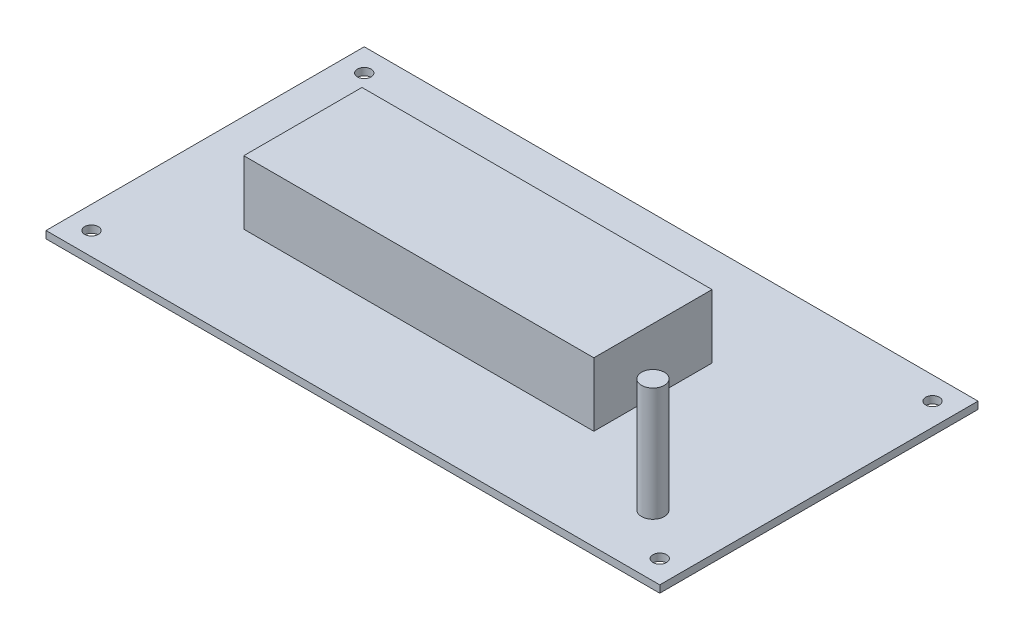
ISO-10303-21;
HEADER;
FILE_DESCRIPTION(('STEP AP214'),'2;1');
FILE_NAME('part.step','',(''),(''),'','','');
FILE_SCHEMA(('AUTOMOTIVE_DESIGN { 1 0 10303 214 1 1 1 1 }'));
ENDSEC;
DATA;
#1=APPLICATION_CONTEXT('core data for automotive mechanical design processes');
#2=APPLICATION_PROTOCOL_DEFINITION('international standard','automotive_design',2000,#1);
#3=PRODUCT_CONTEXT('',#1,'mechanical');
#4=PRODUCT('Part','Part','',(#3));
#5=PRODUCT_RELATED_PRODUCT_CATEGORY('part','',(#4));
#6=PRODUCT_DEFINITION_FORMATION('','',#4);
#7=PRODUCT_DEFINITION_CONTEXT('part definition',#1,'design');
#8=PRODUCT_DEFINITION('design','',#6,#7);
#9=PRODUCT_DEFINITION_SHAPE('','',#8);
#10=(LENGTH_UNIT() NAMED_UNIT(*) SI_UNIT(.MILLI.,.METRE.));
#11=(NAMED_UNIT(*) PLANE_ANGLE_UNIT() SI_UNIT($,.RADIAN.));
#12=(NAMED_UNIT(*) SI_UNIT($,.STERADIAN.) SOLID_ANGLE_UNIT());
#13=UNCERTAINTY_MEASURE_WITH_UNIT(LENGTH_MEASURE(1.E-05),#10,'distance_accuracy_value','');
#14=(GEOMETRIC_REPRESENTATION_CONTEXT(3) GLOBAL_UNCERTAINTY_ASSIGNED_CONTEXT((#13)) GLOBAL_UNIT_ASSIGNED_CONTEXT((#10,
#11,#12)) REPRESENTATION_CONTEXT('',''));
#15=CARTESIAN_POINT('',(0.,0.,0.));
#16=DIRECTION('',(0.,0.,1.));
#17=DIRECTION('',(1.,0.,0.));
#18=AXIS2_PLACEMENT_3D('',#15,#16,#17);
#19=CARTESIAN_POINT('',(0.,1.59999999999999,0.));
#20=DIRECTION('',(0.,-1.,0.));
#21=DIRECTION('',(0.,0.,-1.));
#22=AXIS2_PLACEMENT_3D('',#19,#20,#21);
#23=PLANE('',#22);
#24=CARTESIAN_POINT('',(62.5,1.59999999999999,30.));
#25=DIRECTION('',(0.,1.,0.));
#26=DIRECTION('',(0.,0.,1.));
#27=AXIS2_PLACEMENT_3D('',#24,#25,#26);
#28=CIRCLE('',#27,1.5);
#29=CARTESIAN_POINT('',(62.5,1.59999999999999,31.5));
#30=VERTEX_POINT('',#29);
#31=EDGE_CURVE('E156',#30,#30,#28,.T.);
#32=ORIENTED_EDGE('',*,*,#31,.F.);
#33=EDGE_LOOP('',(#32));
#34=FACE_BOUND('',#33,.T.);
#35=CARTESIAN_POINT('',(-62.5,1.59999999999999,30.));
#36=DIRECTION('',(0.,1.,0.));
#37=DIRECTION('',(0.,0.,1.));
#38=AXIS2_PLACEMENT_3D('',#35,#36,#37);
#39=CIRCLE('',#38,1.5);
#40=CARTESIAN_POINT('',(-62.5,1.59999999999999,31.5));
#41=VERTEX_POINT('',#40);
#42=EDGE_CURVE('E153',#41,#41,#39,.F.);
#43=ORIENTED_EDGE('',*,*,#42,.T.);
#44=EDGE_LOOP('',(#43));
#45=FACE_BOUND('',#44,.T.);
#46=DIRECTION('',(0.,0.,-1.));
#47=VECTOR('',#46,1.);
#48=CARTESIAN_POINT('',(67.5,1.59999999999999,35.));
#49=LINE('',#48,#47);
#50=CARTESIAN_POINT('',(67.5,1.59999999999999,35.));
#51=VERTEX_POINT('',#50);
#52=CARTESIAN_POINT('',(67.5,1.60000000000002,-35.));
#53=VERTEX_POINT('',#52);
#54=EDGE_CURVE('E169',#51,#53,#49,.T.);
#55=ORIENTED_EDGE('',*,*,#54,.T.);
#56=DIRECTION('',(-1.,0.,0.));
#57=VECTOR('',#56,1.);
#58=CARTESIAN_POINT('',(-67.5,1.60000000000002,-35.));
#59=LINE('',#58,#57);
#60=CARTESIAN_POINT('',(-67.5,1.60000000000002,-35.));
#61=VERTEX_POINT('',#60);
#62=EDGE_CURVE('E172',#53,#61,#59,.T.);
#63=ORIENTED_EDGE('',*,*,#62,.T.);
#64=DIRECTION('',(0.,0.,1.));
#65=VECTOR('',#64,1.);
#66=CARTESIAN_POINT('',(-67.5,1.59999999999999,35.));
#67=LINE('',#66,#65);
#68=CARTESIAN_POINT('',(-67.5,1.59999999999999,35.));
#69=VERTEX_POINT('',#68);
#70=EDGE_CURVE('E176',#61,#69,#67,.T.);
#71=ORIENTED_EDGE('',*,*,#70,.T.);
#72=DIRECTION('',(1.,0.,0.));
#73=VECTOR('',#72,1.);
#74=CARTESIAN_POINT('',(-67.5,1.59999999999999,35.));
#75=LINE('',#74,#73);
#76=EDGE_CURVE('E178',#69,#51,#75,.T.);
#77=ORIENTED_EDGE('',*,*,#76,.T.);
#78=EDGE_LOOP('',(#55,#63,#71,#77));
#79=FACE_BOUND('',#78,.T.);
#80=CARTESIAN_POINT('',(62.5,1.59999999999999,-30.));
#81=DIRECTION('',(0.,1.,0.));
#82=DIRECTION('',(0.,0.,1.));
#83=AXIS2_PLACEMENT_3D('',#80,#81,#82);
#84=CIRCLE('',#83,1.5);
#85=CARTESIAN_POINT('',(62.5,1.59999999999999,-28.5));
#86=VERTEX_POINT('',#85);
#87=EDGE_CURVE('E148',#86,#86,#84,.F.);
#88=ORIENTED_EDGE('',*,*,#87,.T.);
#89=EDGE_LOOP('',(#88));
#90=FACE_BOUND('',#89,.T.);
#91=CARTESIAN_POINT('',(-62.5,1.59999999999999,-30.));
#92=DIRECTION('',(0.,1.,0.));
#93=DIRECTION('',(0.,0.,1.));
#94=AXIS2_PLACEMENT_3D('',#91,#92,#93);
#95=CIRCLE('',#94,1.5);
#96=CARTESIAN_POINT('',(-62.5,1.59999999999999,-28.5));
#97=VERTEX_POINT('',#96);
#98=EDGE_CURVE('E145',#97,#97,#95,.T.);
#99=ORIENTED_EDGE('',*,*,#98,.F.);
#100=EDGE_LOOP('',(#99));
#101=FACE_BOUND('',#100,.T.);
#102=CARTESIAN_POINT('',(52.5,1.59999999999996,21.5));
#103=DIRECTION('',(0.,-1.,0.));
#104=DIRECTION('',(0.,0.,-1.));
#105=AXIS2_PLACEMENT_3D('',#102,#103,#104);
#106=CIRCLE('',#105,2.5);
#107=CARTESIAN_POINT('',(52.5,1.59999999999996,19.));
#108=VERTEX_POINT('',#107);
#109=EDGE_CURVE('E13',#108,#108,#106,.F.);
#110=ORIENTED_EDGE('',*,*,#109,.F.);
#111=EDGE_LOOP('',(#110));
#112=FACE_BOUND('',#111,.T.);
#113=DIRECTION('',(0.,0.,1.));
#114=VECTOR('',#113,1.);
#115=CARTESIAN_POINT('',(-46.,1.59999999999999,-13.));
#116=LINE('',#115,#114);
#117=CARTESIAN_POINT('',(-46.,1.59999999999999,-13.));
#118=VERTEX_POINT('',#117);
#119=CARTESIAN_POINT('',(-46.,1.59999999999999,13.));
#120=VERTEX_POINT('',#119);
#121=EDGE_CURVE('E135',#118,#120,#116,.T.);
#122=ORIENTED_EDGE('',*,*,#121,.F.);
#123=DIRECTION('',(-1.,0.,0.));
#124=VECTOR('',#123,1.);
#125=CARTESIAN_POINT('',(-46.,1.59999999999999,-13.));
#126=LINE('',#125,#124);
#127=CARTESIAN_POINT('',(31.,1.59999999999999,-13.));
#128=VERTEX_POINT('',#127);
#129=EDGE_CURVE('E132',#128,#118,#126,.T.);
#130=ORIENTED_EDGE('',*,*,#129,.F.);
#131=DIRECTION('',(0.,0.,-1.));
#132=VECTOR('',#131,1.);
#133=CARTESIAN_POINT('',(31.,1.59999999999999,-13.));
#134=LINE('',#133,#132);
#135=CARTESIAN_POINT('',(31.,1.59999999999999,13.));
#136=VERTEX_POINT('',#135);
#137=EDGE_CURVE('E70',#136,#128,#134,.T.);
#138=ORIENTED_EDGE('',*,*,#137,.F.);
#139=DIRECTION('',(1.,0.,0.));
#140=VECTOR('',#139,1.);
#141=CARTESIAN_POINT('',(-46.,1.59999999999999,13.));
#142=LINE('',#141,#140);
#143=EDGE_CURVE('E65',#120,#136,#142,.T.);
#144=ORIENTED_EDGE('',*,*,#143,.F.);
#145=EDGE_LOOP('',(#122,#130,#138,#144));
#146=FACE_BOUND('',#145,.T.);
#147=ADVANCED_FACE('F50',(#34,#45,#79,#90,#101,#112,#146),#23,.F.);
#148=CARTESIAN_POINT('',(0.,0.,0.));
#149=DIRECTION('',(0.,-1.,0.));
#150=DIRECTION('',(0.,0.,-1.));
#151=AXIS2_PLACEMENT_3D('',#148,#149,#150);
#152=PLANE('',#151);
#153=CARTESIAN_POINT('',(-62.5,0.,30.));
#154=DIRECTION('',(0.,-1.,0.));
#155=DIRECTION('',(0.,0.,-1.));
#156=AXIS2_PLACEMENT_3D('',#153,#154,#155);
#157=CIRCLE('',#156,1.5);
#158=CARTESIAN_POINT('',(-62.5,0.,28.5));
#159=VERTEX_POINT('',#158);
#160=EDGE_CURVE('E152',#159,#159,#157,.T.);
#161=ORIENTED_EDGE('',*,*,#160,.F.);
#162=EDGE_LOOP('',(#161));
#163=FACE_BOUND('',#162,.T.);
#164=CARTESIAN_POINT('',(62.5,0.,-30.));
#165=DIRECTION('',(0.,-1.,0.));
#166=DIRECTION('',(0.,0.,-1.));
#167=AXIS2_PLACEMENT_3D('',#164,#165,#166);
#168=CIRCLE('',#167,1.5);
#169=CARTESIAN_POINT('',(62.5,0.,-31.5));
#170=VERTEX_POINT('',#169);
#171=EDGE_CURVE('E165',#170,#170,#168,.T.);
#172=ORIENTED_EDGE('',*,*,#171,.F.);
#173=EDGE_LOOP('',(#172));
#174=FACE_BOUND('',#173,.T.);
#175=DIRECTION('',(0.,0.,-1.));
#176=VECTOR('',#175,1.);
#177=CARTESIAN_POINT('',(67.5,0.,35.));
#178=LINE('',#177,#176);
#179=CARTESIAN_POINT('',(67.5,0.,35.));
#180=VERTEX_POINT('',#179);
#181=CARTESIAN_POINT('',(67.5,0.,-35.));
#182=VERTEX_POINT('',#181);
#183=EDGE_CURVE('E168',#180,#182,#178,.T.);
#184=ORIENTED_EDGE('',*,*,#183,.F.);
#185=DIRECTION('',(1.,0.,0.));
#186=VECTOR('',#185,1.);
#187=CARTESIAN_POINT('',(-67.5,0.,35.));
#188=LINE('',#187,#186);
#189=CARTESIAN_POINT('',(-67.5,0.,35.));
#190=VERTEX_POINT('',#189);
#191=EDGE_CURVE('E173',#190,#180,#188,.T.);
#192=ORIENTED_EDGE('',*,*,#191,.F.);
#193=DIRECTION('',(0.,0.,1.));
#194=VECTOR('',#193,1.);
#195=CARTESIAN_POINT('',(-67.5,0.,35.));
#196=LINE('',#195,#194);
#197=CARTESIAN_POINT('',(-67.5,0.,-35.));
#198=VERTEX_POINT('',#197);
#199=EDGE_CURVE('E186',#198,#190,#196,.T.);
#200=ORIENTED_EDGE('',*,*,#199,.F.);
#201=DIRECTION('',(-1.,0.,0.));
#202=VECTOR('',#201,1.);
#203=CARTESIAN_POINT('',(-67.5,0.,-35.));
#204=LINE('',#203,#202);
#205=EDGE_CURVE('E183',#182,#198,#204,.T.);
#206=ORIENTED_EDGE('',*,*,#205,.F.);
#207=EDGE_LOOP('',(#184,#192,#200,#206));
#208=FACE_BOUND('',#207,.T.);
#209=CARTESIAN_POINT('',(-62.5,0.,-30.));
#210=DIRECTION('',(0.,-1.,0.));
#211=DIRECTION('',(0.,0.,-1.));
#212=AXIS2_PLACEMENT_3D('',#209,#210,#211);
#213=CIRCLE('',#212,1.5);
#214=CARTESIAN_POINT('',(-62.5,0.,-31.5));
#215=VERTEX_POINT('',#214);
#216=EDGE_CURVE('E149',#215,#215,#213,.F.);
#217=ORIENTED_EDGE('',*,*,#216,.T.);
#218=EDGE_LOOP('',(#217));
#219=FACE_BOUND('',#218,.T.);
#220=CARTESIAN_POINT('',(62.5,0.,30.));
#221=DIRECTION('',(0.,-1.,0.));
#222=DIRECTION('',(0.,0.,-1.));
#223=AXIS2_PLACEMENT_3D('',#220,#221,#222);
#224=CIRCLE('',#223,1.5);
#225=CARTESIAN_POINT('',(62.5,0.,28.5));
#226=VERTEX_POINT('',#225);
#227=EDGE_CURVE('E139',#226,#226,#224,.F.);
#228=ORIENTED_EDGE('',*,*,#227,.T.);
#229=EDGE_LOOP('',(#228));
#230=FACE_BOUND('',#229,.T.);
#231=ADVANCED_FACE('F207',(#163,#174,#208,#219,#230),#152,.T.);
#232=CARTESIAN_POINT('',(67.5,1.59999999999999,35.));
#233=DIRECTION('',(-1.,0.,0.));
#234=DIRECTION('',(0.,0.,1.));
#235=AXIS2_PLACEMENT_3D('',#232,#233,#234);
#236=PLANE('',#235);
#237=ORIENTED_EDGE('',*,*,#183,.T.);
#238=DIRECTION('',(0.,-1.,0.));
#239=VECTOR('',#238,1.);
#240=CARTESIAN_POINT('',(67.5,1.60000000000002,-35.));
#241=LINE('',#240,#239);
#242=EDGE_CURVE('E58',#53,#182,#241,.T.);
#243=ORIENTED_EDGE('',*,*,#242,.F.);
#244=ORIENTED_EDGE('',*,*,#54,.F.);
#245=DIRECTION('',(0.,-1.,0.));
#246=VECTOR('',#245,1.);
#247=CARTESIAN_POINT('',(67.5,1.59999999999999,35.));
#248=LINE('',#247,#246);
#249=EDGE_CURVE('E180',#51,#180,#248,.T.);
#250=ORIENTED_EDGE('',*,*,#249,.T.);
#251=EDGE_LOOP('',(#237,#243,#244,#250));
#252=FACE_BOUND('',#251,.T.);
#253=ADVANCED_FACE('F52',(#252),#236,.F.);
#254=CARTESIAN_POINT('',(-67.5,1.60000000000002,-35.));
#255=DIRECTION('',(0.,0.,1.));
#256=DIRECTION('',(1.,0.,0.));
#257=AXIS2_PLACEMENT_3D('',#254,#255,#256);
#258=PLANE('',#257);
#259=ORIENTED_EDGE('',*,*,#205,.T.);
#260=DIRECTION('',(0.,-1.,0.));
#261=VECTOR('',#260,1.);
#262=CARTESIAN_POINT('',(-67.5,1.60000000000002,-35.));
#263=LINE('',#262,#261);
#264=EDGE_CURVE('E194',#61,#198,#263,.T.);
#265=ORIENTED_EDGE('',*,*,#264,.F.);
#266=ORIENTED_EDGE('',*,*,#62,.F.);
#267=ORIENTED_EDGE('',*,*,#242,.T.);
#268=EDGE_LOOP('',(#259,#265,#266,#267));
#269=FACE_BOUND('',#268,.T.);
#270=ADVANCED_FACE('F199',(#269),#258,.F.);
#271=CARTESIAN_POINT('',(-67.5,1.59999999999999,35.));
#272=DIRECTION('',(1.,0.,0.));
#273=DIRECTION('',(0.,0.,-1.));
#274=AXIS2_PLACEMENT_3D('',#271,#272,#273);
#275=PLANE('',#274);
#276=ORIENTED_EDGE('',*,*,#199,.T.);
#277=DIRECTION('',(0.,-1.,0.));
#278=VECTOR('',#277,1.);
#279=CARTESIAN_POINT('',(-67.5,1.59999999999999,35.));
#280=LINE('',#279,#278);
#281=EDGE_CURVE('E191',#69,#190,#280,.T.);
#282=ORIENTED_EDGE('',*,*,#281,.F.);
#283=ORIENTED_EDGE('',*,*,#70,.F.);
#284=ORIENTED_EDGE('',*,*,#264,.T.);
#285=EDGE_LOOP('',(#276,#282,#283,#284));
#286=FACE_BOUND('',#285,.T.);
#287=ADVANCED_FACE('F212',(#286),#275,.F.);
#288=CARTESIAN_POINT('',(-67.5,1.59999999999999,35.));
#289=DIRECTION('',(0.,0.,-1.));
#290=DIRECTION('',(-1.,0.,0.));
#291=AXIS2_PLACEMENT_3D('',#288,#289,#290);
#292=PLANE('',#291);
#293=ORIENTED_EDGE('',*,*,#191,.T.);
#294=ORIENTED_EDGE('',*,*,#249,.F.);
#295=ORIENTED_EDGE('',*,*,#76,.F.);
#296=ORIENTED_EDGE('',*,*,#281,.T.);
#297=EDGE_LOOP('',(#293,#294,#295,#296));
#298=FACE_BOUND('',#297,.T.);
#299=ADVANCED_FACE('F216',(#298),#292,.F.);
#300=CARTESIAN_POINT('',(62.5,-0.00100000000002876,-30.));
#301=DIRECTION('',(0.,1.,0.));
#302=DIRECTION('',(0.,0.,1.));
#303=AXIS2_PLACEMENT_3D('',#300,#301,#302);
#304=CYLINDRICAL_SURFACE('',#303,1.5);
#305=ORIENTED_EDGE('',*,*,#171,.T.);
#306=EDGE_LOOP('',(#305));
#307=FACE_BOUND('',#306,.T.);
#308=ORIENTED_EDGE('',*,*,#87,.F.);
#309=EDGE_LOOP('',(#308));
#310=FACE_BOUND('',#309,.T.);
#311=ADVANCED_FACE('F267',(#307,#310),#304,.F.);
#312=CARTESIAN_POINT('',(-62.5,-0.00100000000002876,-30.));
#313=DIRECTION('',(0.,1.,0.));
#314=DIRECTION('',(0.,0.,1.));
#315=AXIS2_PLACEMENT_3D('',#312,#313,#314);
#316=CYLINDRICAL_SURFACE('',#315,1.5);
#317=ORIENTED_EDGE('',*,*,#216,.F.);
#318=EDGE_LOOP('',(#317));
#319=FACE_BOUND('',#318,.T.);
#320=ORIENTED_EDGE('',*,*,#98,.T.);
#321=EDGE_LOOP('',(#320));
#322=FACE_BOUND('',#321,.T.);
#323=ADVANCED_FACE('F263',(#319,#322),#316,.F.);
#324=CARTESIAN_POINT('',(-62.5,-0.00100000000005651,30.));
#325=DIRECTION('',(0.,1.,0.));
#326=DIRECTION('',(0.,0.,1.));
#327=AXIS2_PLACEMENT_3D('',#324,#325,#326);
#328=CYLINDRICAL_SURFACE('',#327,1.5);
#329=ORIENTED_EDGE('',*,*,#160,.T.);
#330=EDGE_LOOP('',(#329));
#331=FACE_BOUND('',#330,.T.);
#332=ORIENTED_EDGE('',*,*,#42,.F.);
#333=EDGE_LOOP('',(#332));
#334=FACE_BOUND('',#333,.T.);
#335=ADVANCED_FACE('F266',(#331,#334),#328,.F.);
#336=CARTESIAN_POINT('',(62.5,-0.00100000000005651,30.));
#337=DIRECTION('',(0.,1.,0.));
#338=DIRECTION('',(0.,0.,1.));
#339=AXIS2_PLACEMENT_3D('',#336,#337,#338);
#340=CYLINDRICAL_SURFACE('',#339,1.5);
#341=ORIENTED_EDGE('',*,*,#227,.F.);
#342=EDGE_LOOP('',(#341));
#343=FACE_BOUND('',#342,.T.);
#344=ORIENTED_EDGE('',*,*,#31,.T.);
#345=EDGE_LOOP('',(#344));
#346=FACE_BOUND('',#345,.T.);
#347=ADVANCED_FACE('F261',(#343,#346),#340,.F.);
#348=CARTESIAN_POINT('',(52.5,26.6,21.5));
#349=DIRECTION('',(0.,-1.,0.));
#350=DIRECTION('',(0.,0.,-1.));
#351=AXIS2_PLACEMENT_3D('',#348,#349,#350);
#352=CYLINDRICAL_SURFACE('',#351,2.5);
#353=CARTESIAN_POINT('',(52.5,26.6,21.5));
#354=DIRECTION('',(0.,1.,0.));
#355=DIRECTION('',(0.,0.,1.));
#356=AXIS2_PLACEMENT_3D('',#353,#354,#355);
#357=CIRCLE('',#356,2.5);
#358=CARTESIAN_POINT('',(52.5,26.6,24.));
#359=VERTEX_POINT('',#358);
#360=EDGE_CURVE('E136',#359,#359,#357,.T.);
#361=ORIENTED_EDGE('',*,*,#360,.F.);
#362=EDGE_LOOP('',(#361));
#363=FACE_BOUND('',#362,.T.);
#364=ORIENTED_EDGE('',*,*,#109,.T.);
#365=EDGE_LOOP('',(#364));
#366=FACE_BOUND('',#365,.T.);
#367=ADVANCED_FACE('F257',(#363,#366),#352,.T.);
#368=CARTESIAN_POINT('',(52.5,26.6,21.5));
#369=DIRECTION('',(0.,1.,0.));
#370=DIRECTION('',(0.,0.,1.));
#371=AXIS2_PLACEMENT_3D('',#368,#369,#370);
#372=PLANE('',#371);
#373=ORIENTED_EDGE('',*,*,#360,.T.);
#374=EDGE_LOOP('',(#373));
#375=FACE_BOUND('',#374,.T.);
#376=ADVANCED_FACE('F254',(#375),#372,.T.);
#377=CARTESIAN_POINT('',(-46.,15.5999999999999,-13.));
#378=DIRECTION('',(1.,0.,0.));
#379=DIRECTION('',(0.,0.,-1.));
#380=AXIS2_PLACEMENT_3D('',#377,#378,#379);
#381=PLANE('',#380);
#382=ORIENTED_EDGE('',*,*,#121,.T.);
#383=DIRECTION('',(0.,-1.,0.));
#384=VECTOR('',#383,1.);
#385=CARTESIAN_POINT('',(-46.,15.5999999999999,13.));
#386=LINE('',#385,#384);
#387=CARTESIAN_POINT('',(-46.,15.5999999999999,13.));
#388=VERTEX_POINT('',#387);
#389=EDGE_CURVE('E116',#388,#120,#386,.T.);
#390=ORIENTED_EDGE('',*,*,#389,.F.);
#391=DIRECTION('',(0.,0.,1.));
#392=VECTOR('',#391,1.);
#393=CARTESIAN_POINT('',(-46.,15.5999999999999,-13.));
#394=LINE('',#393,#392);
#395=CARTESIAN_POINT('',(-46.,15.5999999999999,-13.));
#396=VERTEX_POINT('',#395);
#397=EDGE_CURVE('E123',#396,#388,#394,.T.);
#398=ORIENTED_EDGE('',*,*,#397,.F.);
#399=DIRECTION('',(0.,-1.,0.));
#400=VECTOR('',#399,1.);
#401=CARTESIAN_POINT('',(-46.,15.5999999999999,-13.));
#402=LINE('',#401,#400);
#403=EDGE_CURVE('E232',#396,#118,#402,.T.);
#404=ORIENTED_EDGE('',*,*,#403,.T.);
#405=EDGE_LOOP('',(#382,#390,#398,#404));
#406=FACE_BOUND('',#405,.T.);
#407=ADVANCED_FACE('F134',(#406),#381,.F.);
#408=CARTESIAN_POINT('',(-46.,15.5999999999999,13.));
#409=DIRECTION('',(0.,0.,-1.));
#410=DIRECTION('',(-1.,0.,0.));
#411=AXIS2_PLACEMENT_3D('',#408,#409,#410);
#412=PLANE('',#411);
#413=ORIENTED_EDGE('',*,*,#143,.T.);
#414=DIRECTION('',(0.,-1.,0.));
#415=VECTOR('',#414,1.);
#416=CARTESIAN_POINT('',(31.,15.5999999999999,13.));
#417=LINE('',#416,#415);
#418=CARTESIAN_POINT('',(31.,15.5999999999999,13.));
#419=VERTEX_POINT('',#418);
#420=EDGE_CURVE('E119',#419,#136,#417,.T.);
#421=ORIENTED_EDGE('',*,*,#420,.F.);
#422=DIRECTION('',(1.,0.,0.));
#423=VECTOR('',#422,1.);
#424=CARTESIAN_POINT('',(-46.,15.5999999999999,13.));
#425=LINE('',#424,#423);
#426=EDGE_CURVE('E112',#388,#419,#425,.T.);
#427=ORIENTED_EDGE('',*,*,#426,.F.);
#428=ORIENTED_EDGE('',*,*,#389,.T.);
#429=EDGE_LOOP('',(#413,#421,#427,#428));
#430=FACE_BOUND('',#429,.T.);
#431=ADVANCED_FACE('F114',(#430),#412,.F.);
#432=CARTESIAN_POINT('',(31.,15.5999999999999,-13.));
#433=DIRECTION('',(-1.,0.,0.));
#434=DIRECTION('',(0.,0.,1.));
#435=AXIS2_PLACEMENT_3D('',#432,#433,#434);
#436=PLANE('',#435);
#437=ORIENTED_EDGE('',*,*,#137,.T.);
#438=DIRECTION('',(0.,-1.,0.));
#439=VECTOR('',#438,1.);
#440=CARTESIAN_POINT('',(31.,15.5999999999999,-13.));
#441=LINE('',#440,#439);
#442=CARTESIAN_POINT('',(31.,15.5999999999999,-13.));
#443=VERTEX_POINT('',#442);
#444=EDGE_CURVE('E141',#443,#128,#441,.T.);
#445=ORIENTED_EDGE('',*,*,#444,.F.);
#446=DIRECTION('',(0.,0.,-1.));
#447=VECTOR('',#446,1.);
#448=CARTESIAN_POINT('',(31.,15.5999999999999,-13.));
#449=LINE('',#448,#447);
#450=EDGE_CURVE('E122',#419,#443,#449,.T.);
#451=ORIENTED_EDGE('',*,*,#450,.F.);
#452=ORIENTED_EDGE('',*,*,#420,.T.);
#453=EDGE_LOOP('',(#437,#445,#451,#452));
#454=FACE_BOUND('',#453,.T.);
#455=ADVANCED_FACE('F241',(#454),#436,.F.);
#456=CARTESIAN_POINT('',(-46.,15.5999999999999,-13.));
#457=DIRECTION('',(0.,0.,1.));
#458=DIRECTION('',(1.,0.,0.));
#459=AXIS2_PLACEMENT_3D('',#456,#457,#458);
#460=PLANE('',#459);
#461=ORIENTED_EDGE('',*,*,#129,.T.);
#462=ORIENTED_EDGE('',*,*,#403,.F.);
#463=DIRECTION('',(-1.,0.,0.));
#464=VECTOR('',#463,1.);
#465=CARTESIAN_POINT('',(-46.,15.5999999999999,-13.));
#466=LINE('',#465,#464);
#467=EDGE_CURVE('E128',#443,#396,#466,.T.);
#468=ORIENTED_EDGE('',*,*,#467,.F.);
#469=ORIENTED_EDGE('',*,*,#444,.T.);
#470=EDGE_LOOP('',(#461,#462,#468,#469));
#471=FACE_BOUND('',#470,.T.);
#472=ADVANCED_FACE('F231',(#471),#460,.F.);
#473=CARTESIAN_POINT('',(0.,15.6,0.));
#474=DIRECTION('',(0.,1.,0.));
#475=DIRECTION('',(0.,0.,1.));
#476=AXIS2_PLACEMENT_3D('',#473,#474,#475);
#477=PLANE('',#476);
#478=ORIENTED_EDGE('',*,*,#397,.T.);
#479=ORIENTED_EDGE('',*,*,#426,.T.);
#480=ORIENTED_EDGE('',*,*,#450,.T.);
#481=ORIENTED_EDGE('',*,*,#467,.T.);
#482=EDGE_LOOP('',(#478,#479,#480,#481));
#483=FACE_BOUND('',#482,.T.);
#484=ADVANCED_FACE('F126',(#483),#477,.T.);
#485=CLOSED_SHELL('',(#147,#231,#253,#270,#287,#299,#311,#323,#335,#347,#367,#376,#407,#431,
#455,#472,#484));
#486=MANIFOLD_SOLID_BREP('B2',#485);
#487=ADVANCED_BREP_SHAPE_REPRESENTATION('',(#18,#486),#14);
#488=SHAPE_DEFINITION_REPRESENTATION(#9,#487);
ENDSEC;
END-ISO-10303-21;
